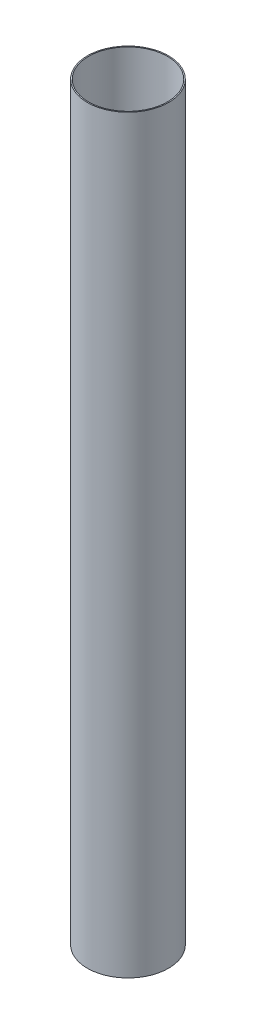
ISO-10303-21;
HEADER;
FILE_DESCRIPTION(('STEP AP214'),'2;1');
FILE_NAME('part.step','',(''),(''),'','','');
FILE_SCHEMA(('AUTOMOTIVE_DESIGN { 1 0 10303 214 1 1 1 1 }'));
ENDSEC;
DATA;
#1=APPLICATION_CONTEXT('core data for automotive mechanical design processes');
#2=APPLICATION_PROTOCOL_DEFINITION('international standard','automotive_design',2000,#1);
#3=PRODUCT_CONTEXT('',#1,'mechanical');
#4=PRODUCT('Part','Part','',(#3));
#5=PRODUCT_RELATED_PRODUCT_CATEGORY('part','',(#4));
#6=PRODUCT_DEFINITION_FORMATION('','',#4);
#7=PRODUCT_DEFINITION_CONTEXT('part definition',#1,'design');
#8=PRODUCT_DEFINITION('design','',#6,#7);
#9=PRODUCT_DEFINITION_SHAPE('','',#8);
#10=(LENGTH_UNIT() NAMED_UNIT(*) SI_UNIT(.MILLI.,.METRE.));
#11=(NAMED_UNIT(*) PLANE_ANGLE_UNIT() SI_UNIT($,.RADIAN.));
#12=(NAMED_UNIT(*) SI_UNIT($,.STERADIAN.) SOLID_ANGLE_UNIT());
#13=UNCERTAINTY_MEASURE_WITH_UNIT(LENGTH_MEASURE(1.E-05),#10,'distance_accuracy_value','');
#14=(GEOMETRIC_REPRESENTATION_CONTEXT(3) GLOBAL_UNCERTAINTY_ASSIGNED_CONTEXT((#13)) GLOBAL_UNIT_ASSIGNED_CONTEXT((#10,
#11,#12)) REPRESENTATION_CONTEXT('',''));
#15=CARTESIAN_POINT('',(0.,0.,0.));
#16=DIRECTION('',(0.,0.,1.));
#17=DIRECTION('',(1.,0.,0.));
#18=AXIS2_PLACEMENT_3D('',#15,#16,#17);
#19=CARTESIAN_POINT('',(0.,1447.8,0.));
#20=DIRECTION('',(0.,1.,0.));
#21=DIRECTION('',(0.,0.,1.));
#22=AXIS2_PLACEMENT_3D('',#19,#20,#21);
#23=PLANE('',#22);
#24=CARTESIAN_POINT('',(0.,1447.8,0.));
#25=DIRECTION('',(0.,1.,0.));
#26=DIRECTION('',(0.,0.,1.));
#27=AXIS2_PLACEMENT_3D('',#24,#25,#26);
#28=CIRCLE('',#27,78.359);
#29=CARTESIAN_POINT('',(0.,1447.8,78.359));
#30=VERTEX_POINT('',#29);
#31=EDGE_CURVE('E10',#30,#30,#28,.T.);
#32=ORIENTED_EDGE('',*,*,#31,.T.);
#33=EDGE_LOOP('',(#32));
#34=FACE_BOUND('',#33,.T.);
#35=CARTESIAN_POINT('',(0.,1447.8,0.));
#36=DIRECTION('',(0.,1.,0.));
#37=DIRECTION('',(0.,0.,1.));
#38=AXIS2_PLACEMENT_3D('',#35,#36,#37);
#39=CIRCLE('',#38,76.2);
#40=CARTESIAN_POINT('',(0.,1447.8,76.2));
#41=VERTEX_POINT('',#40);
#42=EDGE_CURVE('E48',#41,#41,#39,.T.);
#43=ORIENTED_EDGE('',*,*,#42,.F.);
#44=EDGE_LOOP('',(#43));
#45=FACE_BOUND('',#44,.T.);
#46=ADVANCED_FACE('F37',(#34,#45),#23,.T.);
#47=CARTESIAN_POINT('',(0.,0.,0.));
#48=DIRECTION('',(0.,1.,0.));
#49=DIRECTION('',(0.,0.,1.));
#50=AXIS2_PLACEMENT_3D('',#47,#48,#49);
#51=PLANE('',#50);
#52=CARTESIAN_POINT('',(0.,0.,0.));
#53=DIRECTION('',(0.,1.,0.));
#54=DIRECTION('',(0.,0.,1.));
#55=AXIS2_PLACEMENT_3D('',#52,#53,#54);
#56=CIRCLE('',#55,78.359);
#57=CARTESIAN_POINT('',(0.,0.,78.359));
#58=VERTEX_POINT('',#57);
#59=EDGE_CURVE('E41',#58,#58,#56,.T.);
#60=ORIENTED_EDGE('',*,*,#59,.F.);
#61=EDGE_LOOP('',(#60));
#62=FACE_BOUND('',#61,.T.);
#63=CARTESIAN_POINT('',(0.,0.,0.));
#64=DIRECTION('',(0.,1.,0.));
#65=DIRECTION('',(0.,0.,1.));
#66=AXIS2_PLACEMENT_3D('',#63,#64,#65);
#67=CIRCLE('',#66,76.2);
#68=CARTESIAN_POINT('',(0.,0.,76.2));
#69=VERTEX_POINT('',#68);
#70=EDGE_CURVE('E50',#69,#69,#67,.T.);
#71=ORIENTED_EDGE('',*,*,#70,.T.);
#72=EDGE_LOOP('',(#71));
#73=FACE_BOUND('',#72,.T.);
#74=ADVANCED_FACE('F60',(#62,#73),#51,.F.);
#75=CARTESIAN_POINT('',(0.,1447.8,0.));
#76=DIRECTION('',(0.,-1.,0.));
#77=DIRECTION('',(0.,0.,-1.));
#78=AXIS2_PLACEMENT_3D('',#75,#76,#77);
#79=CYLINDRICAL_SURFACE('',#78,78.359);
#80=ORIENTED_EDGE('',*,*,#31,.F.);
#81=EDGE_LOOP('',(#80));
#82=FACE_BOUND('',#81,.T.);
#83=ORIENTED_EDGE('',*,*,#59,.T.);
#84=EDGE_LOOP('',(#83));
#85=FACE_BOUND('',#84,.T.);
#86=ADVANCED_FACE('F39',(#82,#85),#79,.T.);
#87=CARTESIAN_POINT('',(0.,1447.8,0.));
#88=DIRECTION('',(0.,-1.,0.));
#89=DIRECTION('',(0.,0.,-1.));
#90=AXIS2_PLACEMENT_3D('',#87,#88,#89);
#91=CYLINDRICAL_SURFACE('',#90,76.2);
#92=ORIENTED_EDGE('',*,*,#42,.T.);
#93=EDGE_LOOP('',(#92));
#94=FACE_BOUND('',#93,.T.);
#95=ORIENTED_EDGE('',*,*,#70,.F.);
#96=EDGE_LOOP('',(#95));
#97=FACE_BOUND('',#96,.T.);
#98=ADVANCED_FACE('F56',(#94,#97),#91,.F.);
#99=CLOSED_SHELL('',(#46,#74,#86,#98));
#100=MANIFOLD_SOLID_BREP('B2',#99);
#101=ADVANCED_BREP_SHAPE_REPRESENTATION('',(#18,#100),#14);
#102=SHAPE_DEFINITION_REPRESENTATION(#9,#101);
ENDSEC;
END-ISO-10303-21;
